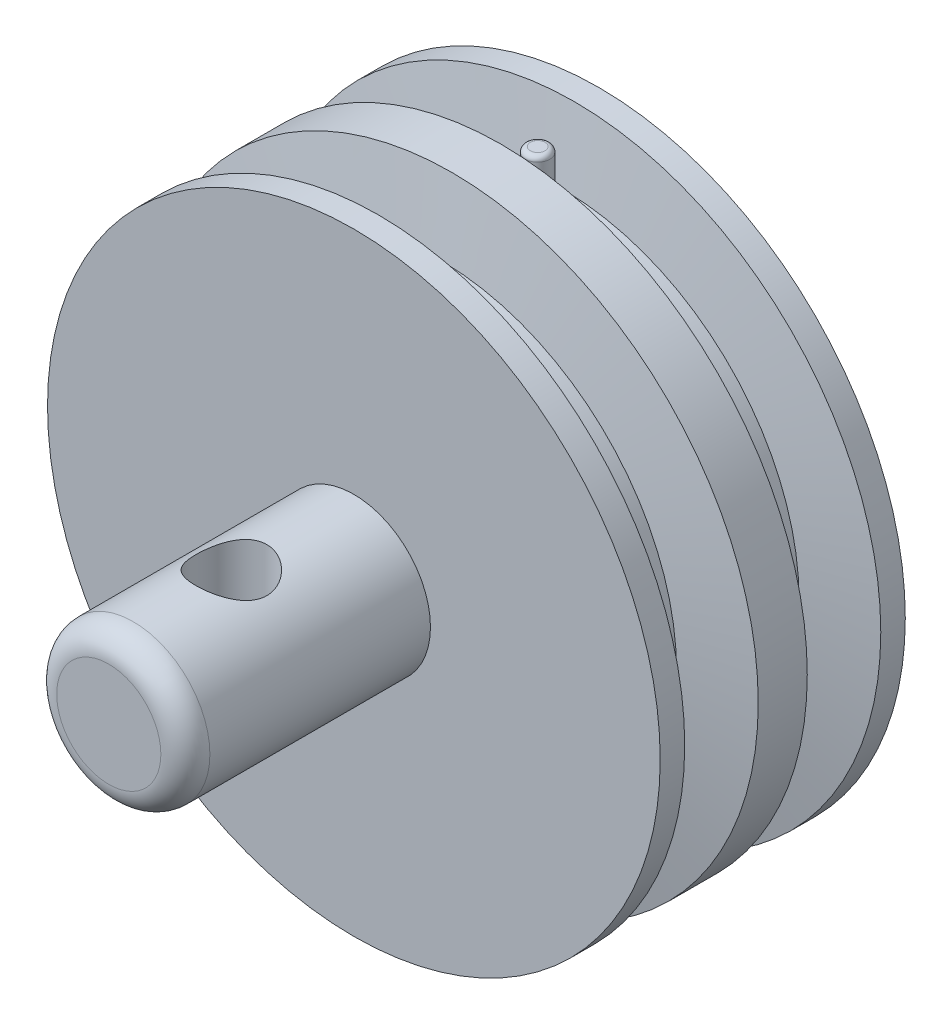
ISO-10303-21;
HEADER;
FILE_DESCRIPTION(('STEP AP214'),'2;1');
FILE_NAME('part.step','',(''),(''),'','','');
FILE_SCHEMA(('AUTOMOTIVE_DESIGN { 1 0 10303 214 1 1 1 1 }'));
ENDSEC;
DATA;
#1=APPLICATION_CONTEXT('core data for automotive mechanical design processes');
#2=APPLICATION_PROTOCOL_DEFINITION('international standard','automotive_design',2000,#1);
#3=PRODUCT_CONTEXT('',#1,'mechanical');
#4=PRODUCT('Part','Part','',(#3));
#5=PRODUCT_RELATED_PRODUCT_CATEGORY('part','',(#4));
#6=PRODUCT_DEFINITION_FORMATION('','',#4);
#7=PRODUCT_DEFINITION_CONTEXT('part definition',#1,'design');
#8=PRODUCT_DEFINITION('design','',#6,#7);
#9=PRODUCT_DEFINITION_SHAPE('','',#8);
#10=(LENGTH_UNIT() NAMED_UNIT(*) SI_UNIT(.MILLI.,.METRE.));
#11=(NAMED_UNIT(*) PLANE_ANGLE_UNIT() SI_UNIT($,.RADIAN.));
#12=(NAMED_UNIT(*) SI_UNIT($,.STERADIAN.) SOLID_ANGLE_UNIT());
#13=UNCERTAINTY_MEASURE_WITH_UNIT(LENGTH_MEASURE(1.E-05),#10,'distance_accuracy_value','');
#14=(GEOMETRIC_REPRESENTATION_CONTEXT(3) GLOBAL_UNCERTAINTY_ASSIGNED_CONTEXT((#13)) GLOBAL_UNIT_ASSIGNED_CONTEXT((#10,
#11,#12)) REPRESENTATION_CONTEXT('',''));
#15=CARTESIAN_POINT('',(0.,0.,0.));
#16=DIRECTION('',(0.,0.,1.));
#17=DIRECTION('',(1.,0.,0.));
#18=AXIS2_PLACEMENT_3D('',#15,#16,#17);
#19=CARTESIAN_POINT('',(0.,0.,-10.));
#20=DIRECTION('',(0.,0.,1.));
#21=DIRECTION('',(1.,0.,0.));
#22=AXIS2_PLACEMENT_3D('',#19,#20,#21);
#23=CYLINDRICAL_SURFACE('',#22,12.5);
#24=CARTESIAN_POINT('',(0.,0.,0.));
#25=DIRECTION('',(0.,0.,-1.));
#26=DIRECTION('',(-1.,0.,0.));
#27=AXIS2_PLACEMENT_3D('',#24,#25,#26);
#28=CIRCLE('',#27,12.5);
#29=CARTESIAN_POINT('',(-12.5,0.,0.));
#30=VERTEX_POINT('',#29);
#31=EDGE_CURVE('E167',#30,#30,#28,.T.);
#32=ORIENTED_EDGE('',*,*,#31,.T.);
#33=EDGE_LOOP('',(#32));
#34=FACE_BOUND('',#33,.T.);
#35=CARTESIAN_POINT('',(0.,0.,-1.));
#36=DIRECTION('',(0.,0.,1.));
#37=DIRECTION('',(1.,0.,0.));
#38=AXIS2_PLACEMENT_3D('',#35,#36,#37);
#39=CIRCLE('',#38,12.5);
#40=CARTESIAN_POINT('',(12.5,0.,-1.));
#41=VERTEX_POINT('',#40);
#42=EDGE_CURVE('E169',#41,#41,#39,.T.);
#43=ORIENTED_EDGE('',*,*,#42,.T.);
#44=EDGE_LOOP('',(#43));
#45=FACE_BOUND('',#44,.T.);
#46=ADVANCED_FACE('F31',(#34,#45),#23,.T.);
#47=CARTESIAN_POINT('',(0.,0.,10.));
#48=DIRECTION('',(0.,0.,-1.));
#49=DIRECTION('',(-1.,0.,0.));
#50=AXIS2_PLACEMENT_3D('',#47,#48,#49);
#51=CYLINDRICAL_SURFACE('',#50,3.125);
#52=CARTESIAN_POINT('',(0.,-3.125,6.45));
#53=CARTESIAN_POINT('',(0.0768716052901547,-3.12499654017137,6.44999586790347));
#54=CARTESIAN_POINT('',(0.153853794345693,-3.1221322690533,6.44385097081543));
#55=CARTESIAN_POINT('',(0.305583189522117,-3.11095827820961,6.4195242663458));
#56=CARTESIAN_POINT('',(0.38032499964858,-3.10263636796138,6.40131551144574));
#57=CARTESIAN_POINT('',(0.52514065145912,-3.08142637615533,6.35370391545));
#58=CARTESIAN_POINT('',(0.595230596894188,-3.0685551409428,6.32434234415211));
#59=CARTESIAN_POINT('',(0.729404512082825,-3.03945941584585,6.25545257524425));
#60=CARTESIAN_POINT('',(0.793489529469112,-3.0232355124642,6.21592615553822));
#61=CARTESIAN_POINT('',(0.917749457079842,-2.98793515867932,6.1253721219745));
#62=CARTESIAN_POINT('',(0.977523710166385,-2.96875171284097,6.07383694512185));
#63=CARTESIAN_POINT('',(1.08793997730668,-2.93009222173806,5.9618103137298));
#64=CARTESIAN_POINT('',(1.13857605001467,-2.91061599496627,5.90131307855665));
#65=CARTESIAN_POINT('',(1.23252324528846,-2.87215137480507,5.76839150867689));
#66=CARTESIAN_POINT('',(1.27515415224006,-2.85327484460032,5.69545042655879));
#67=CARTESIAN_POINT('',(1.34736606669302,-2.81989778505243,5.54244606148625));
#68=CARTESIAN_POINT('',(1.37695532062779,-2.80539449228355,5.46238731773751));
#69=CARTESIAN_POINT('',(1.42049565006142,-2.78359192058556,5.3020019441772));
#70=CARTESIAN_POINT('',(1.43522313728497,-2.77593765788476,5.22193651269336));
#71=CARTESIAN_POINT('',(1.45102635733687,-2.76771311042175,5.06013417367573));
#72=CARTESIAN_POINT('',(1.45211253648423,-2.76713740500849,4.97839859317089));
#73=CARTESIAN_POINT('',(1.44117766650617,-2.77284227245942,4.8242820924474));
#74=CARTESIAN_POINT('',(1.43044874531064,-2.77844701876985,4.75177889664138));
#75=CARTESIAN_POINT('',(1.39839474452883,-2.79471586443441,4.60975065682438));
#76=CARTESIAN_POINT('',(1.37706698618204,-2.80538124278683,4.54022637053359));
#77=CARTESIAN_POINT('',(1.32400195653508,-2.83081665351331,4.4042029321969));
#78=CARTESIAN_POINT('',(1.2920365092816,-2.84567546610072,4.33781016268567));
#79=CARTESIAN_POINT('',(1.21877046953866,-2.87781545405923,4.21103570370394));
#80=CARTESIAN_POINT('',(1.17746581275035,-2.89509768282115,4.15065664784966));
#81=CARTESIAN_POINT('',(1.08151523603346,-2.93238299134741,4.03080953105879));
#82=CARTESIAN_POINT('',(1.02591382066221,-2.9524791464405,3.97213292894236));
#83=CARTESIAN_POINT('',(0.905518094942775,-2.9915994832737,3.86463551697012));
#84=CARTESIAN_POINT('',(0.840720508367833,-3.01062327958604,3.81581823467793));
#85=CARTESIAN_POINT('',(0.700870105289448,-3.04627393989381,3.72786216093632));
#86=CARTESIAN_POINT('',(0.625538638503988,-3.06279419603615,3.6891198489341));
#87=CARTESIAN_POINT('',(0.468464075733848,-3.0907135911736,3.62514783418049));
#88=CARTESIAN_POINT('',(0.386725430084813,-3.10211624839841,3.59990884590951));
#89=CARTESIAN_POINT('',(0.225701629181554,-3.1178091382463,3.56548827152849));
#90=CARTESIAN_POINT('',(0.146688231370913,-3.12256644412945,3.55524938944003));
#91=CARTESIAN_POINT('',(-0.0120671068368493,-3.12598356044019,3.54787692371127));
#92=CARTESIAN_POINT('',(-0.0918087573396272,-3.12464569988898,3.55073833432627));
#93=CARTESIAN_POINT('',(-0.244306341537902,-3.11631184074593,3.56880129206096));
#94=CARTESIAN_POINT('',(-0.317180917692467,-3.10968669493311,3.58319426154248));
#95=CARTESIAN_POINT('',(-0.459364294809646,-3.09188387501783,3.62270883006413));
#96=CARTESIAN_POINT('',(-0.528672675335814,-3.08070566551097,3.64783169087178));
#97=CARTESIAN_POINT('',(-0.664190110343602,-3.05440500807457,3.70885909750921));
#98=CARTESIAN_POINT('',(-0.730238366156991,-3.03917186265437,3.74507137345677));
#99=CARTESIAN_POINT('',(-0.855555721280659,-3.00630223937028,3.82691356952088));
#100=CARTESIAN_POINT('',(-0.914821823418104,-2.988664706445,3.87254762852755));
#101=CARTESIAN_POINT('',(-1.03033733772604,-2.95093809581905,3.97654613302277));
#102=CARTESIAN_POINT('',(-1.08587629993254,-2.93076920504046,4.03567250679323));
#103=CARTESIAN_POINT('',(-1.18651148267303,-2.89149442525721,4.16259117280456));
#104=CARTESIAN_POINT('',(-1.23160288108748,-2.87238903019232,4.23038744436015));
#105=CARTESIAN_POINT('',(-1.31132173736169,-2.83690484600783,4.37550331939023));
#106=CARTESIAN_POINT('',(-1.34557774767094,-2.82063004339646,4.45305448470597));
#107=CARTESIAN_POINT('',(-1.40019947858562,-2.7939231345433,4.61382844819183));
#108=CARTESIAN_POINT('',(-1.42058035508842,-2.78348465548357,4.69704494839089));
#109=CARTESIAN_POINT('',(-1.44521141620336,-2.77076949653223,4.85877503799353));
#110=CARTESIAN_POINT('',(-1.45074264390206,-2.76784564689242,4.93704246107132));
#111=CARTESIAN_POINT('',(-1.44909761484816,-2.76870801694762,5.09339561264748));
#112=CARTESIAN_POINT('',(-1.4419248091463,-2.77249241434751,5.17148138472174));
#113=CARTESIAN_POINT('',(-1.41622586449008,-2.78569771981091,5.31944037746666));
#114=CARTESIAN_POINT('',(-1.39854545832788,-2.79469761783954,5.38950224210822));
#115=CARTESIAN_POINT('',(-1.35327636495865,-2.81689544042352,5.52563526385941));
#116=CARTESIAN_POINT('',(-1.32568473874645,-2.8300946100692,5.59170523044294));
#117=CARTESIAN_POINT('',(-1.2593046370902,-2.86027749752047,5.72277268974585));
#118=CARTESIAN_POINT('',(-1.21989708618644,-2.87745357358766,5.78741124497976));
#119=CARTESIAN_POINT('',(-1.13176460858238,-2.91324476703214,5.90955289071172));
#120=CARTESIAN_POINT('',(-1.08303538229627,-2.93186054609707,5.96705266821609));
#121=CARTESIAN_POINT('',(-0.971970206104432,-2.97063737208714,6.07916498422777));
#122=CARTESIAN_POINT('',(-0.908765762261198,-2.99076947267675,6.13293163771408));
#123=CARTESIAN_POINT('',(-0.773566705282083,-3.02855419940087,6.22921938739997));
#124=CARTESIAN_POINT('',(-0.701567962017635,-3.04620565209778,6.27173516986462));
#125=CARTESIAN_POINT('',(-0.551002976500324,-3.0769933709418,6.34380804229753));
#126=CARTESIAN_POINT('',(-0.472479835059436,-3.09015673066736,6.37344319934886));
#127=CARTESIAN_POINT('',(-0.310905162734269,-3.11055356763277,6.41874378341916));
#128=CARTESIAN_POINT('',(-0.227867946617002,-3.11780474283607,6.43445091605314));
#129=CARTESIAN_POINT('',(-0.120160943643351,-3.12278214322513,6.44521421298406));
#130=CARTESIAN_POINT('',(-0.096174760864419,-3.12361220445218,6.4470069674181));
#131=CARTESIAN_POINT('',(-0.0481293336872137,-3.12472167973571,6.44940051915697));
#132=CARTESIAN_POINT('',(-0.0240700879112951,-3.12500108334383,6.4500012938448));
#133=CARTESIAN_POINT('',(0.,-3.125,6.45));
#134=B_SPLINE_CURVE_WITH_KNOTS('',3,(#52,#53,#54,#55,#56,#57,#58,#59,#60,#61,#62,#63,#64,#65,
#66,#67,#68,#69,#70,#71,#72,#73,#74,#75,#76,#77,#78,#79,#80,#81,#82,#83,#84,#85,#86,#87,#88,#89,
#90,#91,#92,#93,#94,#95,#96,#97,#98,#99,#100,#101,#102,#103,#104,#105,#106,#107,#108,#109,#110,
#111,#112,#113,#114,#115,#116,#117,#118,#119,#120,#121,#122,#123,#124,#125,#126,#127,#128,#129,
#130,#131,#132,#133),.UNSPECIFIED.,.T.,.F.,(4,2,2,2,2,2,2,2,2,2,2,2,2,2,2,2,2,2,2,2,2,2,2,2,2,2,
2,2,2,2,2,2,2,2,2,2,2,2,2,2,4),(0.,0.230516371630332,0.461549400753721,0.691735716509659,
0.921881798400275,1.16451177160954,1.40729893098373,1.66569497064884,1.92392738738805,
2.16783553157161,2.41155688298075,2.63105230784912,2.85060323644229,3.07520475712157,
3.29990421014558,3.54869036961603,3.79756538514588,4.05511168491926,4.31248065539265,
4.55065256428205,4.78873347304892,5.01144440127294,5.2341815261106,5.46376657658349,
5.69345269676118,5.94311138890871,6.19288508360442,6.45047200657537,6.70777711231321,
6.94204099932318,7.17624125830721,7.39374728131239,7.61131785537682,7.84325593711941,
8.07530125846212,8.33026199196084,8.58534292819831,8.83885554378647,9.09160646090031,
9.16378453019225,9.23596396900053),.UNSPECIFIED.);
#135=CARTESIAN_POINT('',(0.,-3.125,6.45));
#136=VERTEX_POINT('',#135);
#137=EDGE_CURVE('E98',#136,#136,#134,.T.);
#138=ORIENTED_EDGE('',*,*,#137,.T.);
#139=EDGE_LOOP('',(#138));
#140=FACE_BOUND('',#139,.T.);
#141=CARTESIAN_POINT('',(0.,3.125,6.45));
#142=CARTESIAN_POINT('',(-0.0768716052901535,3.12499654017137,6.44999586790347));
#143=CARTESIAN_POINT('',(-0.153853794345692,3.1221322690533,6.44385097081543));
#144=CARTESIAN_POINT('',(-0.305583189522116,3.11095827820961,6.4195242663458));
#145=CARTESIAN_POINT('',(-0.380324999648579,3.10263636796138,6.40131551144574));
#146=CARTESIAN_POINT('',(-0.525140651459119,3.08142637615533,6.35370391545));
#147=CARTESIAN_POINT('',(-0.595230596894187,3.0685551409428,6.32434234415211));
#148=CARTESIAN_POINT('',(-0.729404512082824,3.03945941584585,6.25545257524425));
#149=CARTESIAN_POINT('',(-0.793489529469111,3.0232355124642,6.21592615553822));
#150=CARTESIAN_POINT('',(-0.917749457079841,2.98793515867932,6.1253721219745));
#151=CARTESIAN_POINT('',(-0.977523710166384,2.96875171284097,6.07383694512185));
#152=CARTESIAN_POINT('',(-1.08793997730667,2.93009222173806,5.9618103137298));
#153=CARTESIAN_POINT('',(-1.13857605001467,2.91061599496627,5.90131307855665));
#154=CARTESIAN_POINT('',(-1.23252324528846,2.87215137480507,5.76839150867689));
#155=CARTESIAN_POINT('',(-1.27515415224006,2.85327484460032,5.69545042655879));
#156=CARTESIAN_POINT('',(-1.34736606669301,2.81989778505243,5.54244606148625));
#157=CARTESIAN_POINT('',(-1.37695532062778,2.80539449228355,5.46238731773751));
#158=CARTESIAN_POINT('',(-1.42049565006142,2.78359192058556,5.3020019441772));
#159=CARTESIAN_POINT('',(-1.43522313728497,2.77593765788476,5.22193651269336));
#160=CARTESIAN_POINT('',(-1.45102635733687,2.76771311042175,5.06013417367573));
#161=CARTESIAN_POINT('',(-1.45211253648423,2.76713740500849,4.97839859317089));
#162=CARTESIAN_POINT('',(-1.44117766650616,2.77284227245942,4.8242820924474));
#163=CARTESIAN_POINT('',(-1.43044874531064,2.77844701876985,4.75177889664138));
#164=CARTESIAN_POINT('',(-1.39839474452883,2.79471586443441,4.60975065682438));
#165=CARTESIAN_POINT('',(-1.37706698618204,2.80538124278683,4.54022637053359));
#166=CARTESIAN_POINT('',(-1.32400195653508,2.83081665351331,4.4042029321969));
#167=CARTESIAN_POINT('',(-1.2920365092816,2.84567546610072,4.33781016268567));
#168=CARTESIAN_POINT('',(-1.21877046953866,2.87781545405923,4.21103570370394));
#169=CARTESIAN_POINT('',(-1.17746581275035,2.89509768282115,4.15065664784966));
#170=CARTESIAN_POINT('',(-1.08151523603346,2.93238299134741,4.03080953105879));
#171=CARTESIAN_POINT('',(-1.02591382066221,2.9524791464405,3.97213292894236));
#172=CARTESIAN_POINT('',(-0.905518094942774,2.9915994832737,3.86463551697012));
#173=CARTESIAN_POINT('',(-0.840720508367833,3.01062327958604,3.81581823467793));
#174=CARTESIAN_POINT('',(-0.700870105289447,3.04627393989381,3.72786216093632));
#175=CARTESIAN_POINT('',(-0.625538638503987,3.06279419603615,3.6891198489341));
#176=CARTESIAN_POINT('',(-0.468464075733847,3.0907135911736,3.62514783418049));
#177=CARTESIAN_POINT('',(-0.386725430084812,3.10211624839841,3.59990884590951));
#178=CARTESIAN_POINT('',(-0.225701629181552,3.1178091382463,3.56548827152849));
#179=CARTESIAN_POINT('',(-0.146688231370912,3.12256644412945,3.55524938944003));
#180=CARTESIAN_POINT('',(0.0120671068368506,3.12598356044019,3.54787692371127));
#181=CARTESIAN_POINT('',(0.0918087573396285,3.12464569988898,3.55073833432627));
#182=CARTESIAN_POINT('',(0.244306341537903,3.11631184074593,3.56880129206096));
#183=CARTESIAN_POINT('',(0.317180917692469,3.10968669493311,3.58319426154248));
#184=CARTESIAN_POINT('',(0.459364294809647,3.09188387501783,3.62270883006413));
#185=CARTESIAN_POINT('',(0.528672675335815,3.08070566551097,3.64783169087179));
#186=CARTESIAN_POINT('',(0.664190110343604,3.05440500807457,3.70885909750921));
#187=CARTESIAN_POINT('',(0.730238366156993,3.03917186265437,3.74507137345677));
#188=CARTESIAN_POINT('',(0.855555721280661,3.00630223937028,3.82691356952088));
#189=CARTESIAN_POINT('',(0.914821823418105,2.988664706445,3.87254762852755));
#190=CARTESIAN_POINT('',(1.03033733772604,2.95093809581905,3.97654613302277));
#191=CARTESIAN_POINT('',(1.08587629993254,2.93076920504045,4.03567250679323));
#192=CARTESIAN_POINT('',(1.18651148267303,2.89149442525721,4.16259117280456));
#193=CARTESIAN_POINT('',(1.23160288108748,2.87238903019231,4.23038744436015));
#194=CARTESIAN_POINT('',(1.31132173736169,2.83690484600783,4.37550331939023));
#195=CARTESIAN_POINT('',(1.34557774767094,2.82063004339646,4.45305448470597));
#196=CARTESIAN_POINT('',(1.40019947858562,2.7939231345433,4.61382844819183));
#197=CARTESIAN_POINT('',(1.42058035508842,2.78348465548357,4.69704494839089));
#198=CARTESIAN_POINT('',(1.44521141620336,2.77076949653223,4.85877503799353));
#199=CARTESIAN_POINT('',(1.45074264390206,2.76784564689242,4.93704246107132));
#200=CARTESIAN_POINT('',(1.44909761484816,2.76870801694762,5.09339561264748));
#201=CARTESIAN_POINT('',(1.4419248091463,2.77249241434751,5.17148138472174));
#202=CARTESIAN_POINT('',(1.41622586449008,2.78569771981091,5.31944037746666));
#203=CARTESIAN_POINT('',(1.39854545832788,2.79469761783954,5.38950224210822));
#204=CARTESIAN_POINT('',(1.35327636495865,2.81689544042352,5.52563526385941));
#205=CARTESIAN_POINT('',(1.32568473874645,2.83009461006919,5.59170523044294));
#206=CARTESIAN_POINT('',(1.2593046370902,2.86027749752047,5.72277268974585));
#207=CARTESIAN_POINT('',(1.21989708618644,2.87745357358766,5.78741124497976));
#208=CARTESIAN_POINT('',(1.13176460858238,2.91324476703214,5.90955289071172));
#209=CARTESIAN_POINT('',(1.08303538229627,2.93186054609707,5.96705266821609));
#210=CARTESIAN_POINT('',(0.971970206104434,2.97063737208714,6.07916498422777));
#211=CARTESIAN_POINT('',(0.9087657622612,2.99076947267675,6.13293163771408));
#212=CARTESIAN_POINT('',(0.773566705282085,3.02855419940087,6.22921938739997));
#213=CARTESIAN_POINT('',(0.701567962017637,3.04620565209778,6.27173516986462));
#214=CARTESIAN_POINT('',(0.551002976500326,3.0769933709418,6.34380804229753));
#215=CARTESIAN_POINT('',(0.472479835059438,3.09015673066736,6.37344319934886));
#216=CARTESIAN_POINT('',(0.310905162734271,3.11055356763277,6.41874378341916));
#217=CARTESIAN_POINT('',(0.227867946617004,3.11780474283607,6.43445091605314));
#218=CARTESIAN_POINT('',(0.120160943643353,3.12278214322513,6.44521421298406));
#219=CARTESIAN_POINT('',(0.0961747608644205,3.12361220445218,6.4470069674181));
#220=CARTESIAN_POINT('',(0.048129333687215,3.12472167973571,6.44940051915697));
#221=CARTESIAN_POINT('',(0.0240700879112964,3.12500108334383,6.4500012938448));
#222=CARTESIAN_POINT('',(0.,3.125,6.45));
#223=B_SPLINE_CURVE_WITH_KNOTS('',3,(#141,#142,#143,#144,#145,#146,#147,#148,#149,#150,#151,
#152,#153,#154,#155,#156,#157,#158,#159,#160,#161,#162,#163,#164,#165,#166,#167,#168,#169,#170,
#171,#172,#173,#174,#175,#176,#177,#178,#179,#180,#181,#182,#183,#184,#185,#186,#187,#188,#189,
#190,#191,#192,#193,#194,#195,#196,#197,#198,#199,#200,#201,#202,#203,#204,#205,#206,#207,#208,
#209,#210,#211,#212,#213,#214,#215,#216,#217,#218,#219,#220,#221,#222),.UNSPECIFIED.,.T.,.F.,(4,
2,2,2,2,2,2,2,2,2,2,2,2,2,2,2,2,2,2,2,2,2,2,2,2,2,2,2,2,2,2,2,2,2,2,2,2,2,2,2,4),(0.,
0.230516371630333,0.461549400753721,0.691735716509659,0.921881798400275,1.16451177160954,
1.40729893098373,1.66569497064884,1.92392738738805,2.16783553157161,2.41155688298075,
2.63105230784912,2.85060323644229,3.07520475712157,3.29990421014557,3.54869036961602,
3.79756538514588,4.05511168491926,4.31248065539265,4.55065256428205,4.78873347304892,
5.01144440127294,5.2341815261106,5.46376657658349,5.69345269676118,5.9431113889087,
6.19288508360442,6.45047200657537,6.70777711231321,6.94204099932318,7.17624125830721,
7.39374728131239,7.61131785537682,7.84325593711941,8.07530125846212,8.33026199196084,
8.58534292819831,8.83885554378647,9.09160646090031,9.16378453019225,9.23596396900053),.UNSPECIFIED.);
#224=CARTESIAN_POINT('',(0.,3.125,6.45));
#225=VERTEX_POINT('',#224);
#226=EDGE_CURVE('E92',#225,#225,#223,.T.);
#227=ORIENTED_EDGE('',*,*,#226,.T.);
#228=EDGE_LOOP('',(#227));
#229=FACE_BOUND('',#228,.T.);
#230=CARTESIAN_POINT('',(0.,0.,9.));
#231=DIRECTION('',(0.,0.,1.));
#232=DIRECTION('',(1.,0.,0.));
#233=AXIS2_PLACEMENT_3D('',#230,#231,#232);
#234=CIRCLE('',#233,3.125);
#235=CARTESIAN_POINT('',(3.125,0.,9.));
#236=VERTEX_POINT('',#235);
#237=EDGE_CURVE('E174',#236,#236,#234,.F.);
#238=ORIENTED_EDGE('',*,*,#237,.T.);
#239=EDGE_LOOP('',(#238));
#240=FACE_BOUND('',#239,.T.);
#241=CARTESIAN_POINT('',(0.,0.,0.));
#242=DIRECTION('',(0.,0.,1.));
#243=DIRECTION('',(1.,0.,0.));
#244=AXIS2_PLACEMENT_3D('',#241,#242,#243);
#245=CIRCLE('',#244,3.125);
#246=CARTESIAN_POINT('',(3.125,0.,0.));
#247=VERTEX_POINT('',#246);
#248=EDGE_CURVE('E166',#247,#247,#245,.T.);
#249=ORIENTED_EDGE('',*,*,#248,.T.);
#250=EDGE_LOOP('',(#249));
#251=FACE_BOUND('',#250,.T.);
#252=ADVANCED_FACE('F104',(#140,#229,#240,#251),#51,.T.);
#253=CARTESIAN_POINT('',(0.,0.,10.));
#254=DIRECTION('',(0.,0.,1.));
#255=DIRECTION('',(1.,0.,0.));
#256=AXIS2_PLACEMENT_3D('',#253,#254,#255);
#257=PLANE('',#256);
#258=CARTESIAN_POINT('',(0.,0.,10.));
#259=DIRECTION('',(0.,0.,1.));
#260=DIRECTION('',(1.,0.,0.));
#261=AXIS2_PLACEMENT_3D('',#258,#259,#260);
#262=CIRCLE('',#261,2.125);
#263=CARTESIAN_POINT('',(2.125,0.,10.));
#264=VERTEX_POINT('',#263);
#265=EDGE_CURVE('E172',#264,#264,#262,.T.);
#266=ORIENTED_EDGE('',*,*,#265,.T.);
#267=EDGE_LOOP('',(#266));
#268=FACE_BOUND('',#267,.T.);
#269=ADVANCED_FACE('F109',(#268),#257,.T.);
#270=CARTESIAN_POINT('',(0.,0.,9.));
#271=DIRECTION('',(0.,0.,1.));
#272=DIRECTION('',(1.,0.,0.));
#273=AXIS2_PLACEMENT_3D('',#270,#271,#272);
#274=TOROIDAL_SURFACE('',#273,2.125,1.);
#275=ORIENTED_EDGE('',*,*,#237,.F.);
#276=EDGE_LOOP('',(#275));
#277=FACE_BOUND('',#276,.T.);
#278=ORIENTED_EDGE('',*,*,#265,.F.);
#279=EDGE_LOOP('',(#278));
#280=FACE_BOUND('',#279,.T.);
#281=ADVANCED_FACE('F112',(#277,#280),#274,.T.);
#282=CARTESIAN_POINT('',(0.,0.,0.));
#283=DIRECTION('',(0.,0.,-1.));
#284=DIRECTION('',(-1.,0.,0.));
#285=AXIS2_PLACEMENT_3D('',#282,#283,#284);
#286=PLANE('',#285);
#287=ORIENTED_EDGE('',*,*,#248,.F.);
#288=EDGE_LOOP('',(#287));
#289=FACE_BOUND('',#288,.T.);
#290=ORIENTED_EDGE('',*,*,#31,.F.);
#291=EDGE_LOOP('',(#290));
#292=FACE_BOUND('',#291,.T.);
#293=ADVANCED_FACE('F115',(#289,#292),#286,.F.);
#294=CARTESIAN_POINT('',(0.,0.,-1.));
#295=DIRECTION('',(0.,0.,1.));
#296=DIRECTION('',(1.,0.,0.));
#297=AXIS2_PLACEMENT_3D('',#294,#295,#296);
#298=CONICAL_SURFACE('',#297,12.5,1.39626340159547);
#299=CARTESIAN_POINT('',(0.,0.,-1.5));
#300=DIRECTION('',(0.,0.,1.));
#301=DIRECTION('',(1.,0.,0.));
#302=AXIS2_PLACEMENT_3D('',#299,#300,#301);
#303=CIRCLE('',#302,9.66435909019109);
#304=CARTESIAN_POINT('',(9.66435909019109,0.,-1.5));
#305=VERTEX_POINT('',#304);
#306=EDGE_CURVE('E193',#305,#305,#303,.T.);
#307=ORIENTED_EDGE('',*,*,#306,.T.);
#308=EDGE_LOOP('',(#307));
#309=FACE_BOUND('',#308,.T.);
#310=ORIENTED_EDGE('',*,*,#42,.F.);
#311=EDGE_LOOP('',(#310));
#312=FACE_BOUND('',#311,.T.);
#313=ADVANCED_FACE('F209',(#309,#312),#298,.T.);
#314=CARTESIAN_POINT('',(0.,0.,0.));
#315=DIRECTION('',(0.,0.,1.));
#316=DIRECTION('',(1.,0.,0.));
#317=AXIS2_PLACEMENT_3D('',#314,#315,#316);
#318=CYLINDRICAL_SURFACE('',#317,9.66435909019109);
#319=CARTESIAN_POINT('',(0.,-9.66435909019109,-3.));
#320=CARTESIAN_POINT('',(0.0280650760185085,-9.66435891728428,-2.99999876185837));
#321=CARTESIAN_POINT('',(0.0561500232965514,-9.66423553062454,-2.997629117818));
#322=CARTESIAN_POINT('',(0.111545062637845,-9.66375517870961,-2.98820979459429));
#323=CARTESIAN_POINT('',(0.138854203677524,-9.66339793867225,-2.98115460966927));
#324=CARTESIAN_POINT('',(0.191887169539539,-9.66249031105015,-2.96256682412411));
#325=CARTESIAN_POINT('',(0.217611798056304,-9.66194002234765,-2.95103651540437));
#326=CARTESIAN_POINT('',(0.266753507647339,-9.66070826267977,-2.92382933180292));
#327=CARTESIAN_POINT('',(0.290171129624943,-9.6600268225755,-2.90815343209206));
#328=CARTESIAN_POINT('',(0.334066117195868,-9.65860859399509,-2.87308139834803));
#329=CARTESIAN_POINT('',(0.354540702327894,-9.65787175416738,-2.85368178618129));
#330=CARTESIAN_POINT('',(0.391944710164128,-9.65642621460703,-2.81171999390288));
#331=CARTESIAN_POINT('',(0.408873987638484,-9.65571751602814,-2.78915768429776));
#332=CARTESIAN_POINT('',(0.43871464055259,-9.65440780762013,-2.74149617423983));
#333=CARTESIAN_POINT('',(0.451623821068999,-9.65380685669561,-2.71639559779699));
#334=CARTESIAN_POINT('',(0.473043760791749,-9.65278104382706,-2.66437974680399));
#335=CARTESIAN_POINT('',(0.481554555120606,-9.65235618047693,-2.63746448674658));
#336=CARTESIAN_POINT('',(0.493928722725643,-9.65173092227323,-2.58260908115773));
#337=CARTESIAN_POINT('',(0.497796290018725,-9.65153032486166,-2.5546698840496));
#338=CARTESIAN_POINT('',(0.500787158539221,-9.65137561166038,-2.49853816295734));
#339=CARTESIAN_POINT('',(0.499910499251231,-9.65142149381929,-2.4703456410835));
#340=CARTESIAN_POINT('',(0.493441291406903,-9.65175437744844,-2.4145360688589));
#341=CARTESIAN_POINT('',(0.487853275171575,-9.65204114718408,-2.38691849156703));
#342=CARTESIAN_POINT('',(0.47212700115365,-9.65282311980368,-2.33301389326366));
#343=CARTESIAN_POINT('',(0.461988723130834,-9.65331832361479,-2.30672687817126));
#344=CARTESIAN_POINT('',(0.437444541842198,-9.65446161862094,-2.25621499977897));
#345=CARTESIAN_POINT('',(0.423036573545687,-9.65510978376459,-2.23199114163775));
#346=CARTESIAN_POINT('',(0.390363504372272,-9.65648587300675,-2.18630419683438));
#347=CARTESIAN_POINT('',(0.372098374244781,-9.65721379771009,-2.16484113111053));
#348=CARTESIAN_POINT('',(0.332203891019647,-9.65866839322497,-2.12525865039991));
#349=CARTESIAN_POINT('',(0.310570613383147,-9.65939506156106,-2.10714319055914));
#350=CARTESIAN_POINT('',(0.264567712677067,-9.66076442025787,-2.07480063417131));
#351=CARTESIAN_POINT('',(0.240198088903051,-9.66140711059697,-2.06057353862526));
#352=CARTESIAN_POINT('',(0.18941193570775,-9.66253611337631,-2.03641193947923));
#353=CARTESIAN_POINT('',(0.162995339801536,-9.66302242073464,-2.02647757537463));
#354=CARTESIAN_POINT('',(0.10886614456961,-9.66378377765343,-2.01118603161316));
#355=CARTESIAN_POINT('',(0.081153555630165,-9.66405882890661,-2.00582881528103));
#356=CARTESIAN_POINT('',(0.0252533664647164,-9.66436645783231,-1.99984851677907));
#357=CARTESIAN_POINT('',(-0.0029336470566775,-9.66439931568713,-1.99921996421999));
#358=CARTESIAN_POINT('',(-0.0590127410688857,-9.66421959880437,-2.0027005574827));
#359=CARTESIAN_POINT('',(-0.0869048226049272,-9.66400702493688,-2.00680968650865));
#360=CARTESIAN_POINT('',(-0.141586959628782,-9.66336056617158,-2.01964447190429));
#361=CARTESIAN_POINT('',(-0.16837760327541,-9.66292680109134,-2.02836762898593));
#362=CARTESIAN_POINT('',(-0.220114498812783,-9.66188679137154,-2.05018031766824));
#363=CARTESIAN_POINT('',(-0.245060739329895,-9.66128054566848,-2.06326987619188));
#364=CARTESIAN_POINT('',(-0.29242580598746,-9.65996306628065,-2.09345779871617));
#365=CARTESIAN_POINT('',(-0.314842293356485,-9.65925173682541,-2.11055982802527));
#366=CARTESIAN_POINT('',(-0.356488012655926,-9.65780451192519,-2.14828187563756));
#367=CARTESIAN_POINT('',(-0.375717222769419,-9.65706861631209,-2.1689019180196));
#368=CARTESIAN_POINT('',(-0.410460972094506,-9.65565440103037,-2.2130982060814));
#369=CARTESIAN_POINT('',(-0.425971970725582,-9.65497613663326,-2.23667723710347));
#370=CARTESIAN_POINT('',(-0.452814795687847,-9.65375453932591,-2.28610811603758));
#371=CARTESIAN_POINT('',(-0.464146641166448,-9.65321120579747,-2.31195995353576));
#372=CARTESIAN_POINT('',(-0.482303322181929,-9.65232113503537,-2.36518951280983));
#373=CARTESIAN_POINT('',(-0.489130411224373,-9.65197429951581,-2.39256646420259));
#374=CARTESIAN_POINT('',(-0.498091152475214,-9.65151606057403,-2.44807989082278));
#375=CARTESIAN_POINT('',(-0.500224833827037,-9.65140465568992,-2.47621636133294));
#376=CARTESIAN_POINT('',(-0.499737916699052,-9.65142987694451,-2.53241489733293));
#377=CARTESIAN_POINT('',(-0.497122887586933,-9.65156621252914,-2.56047701137813));
#378=CARTESIAN_POINT('',(-0.487224297598006,-9.65207093482535,-2.61576321960929));
#379=CARTESIAN_POINT('',(-0.479940727872444,-9.65243932197675,-2.64298731220676));
#380=CARTESIAN_POINT('',(-0.460912965797975,-9.65336656184317,-2.69582580310447));
#381=CARTESIAN_POINT('',(-0.449168747406938,-9.65392541567017,-2.72144019200592));
#382=CARTESIAN_POINT('',(-0.421553989841467,-9.65517058628802,-2.77033405990191));
#383=CARTESIAN_POINT('',(-0.405683574787143,-9.65585689924461,-2.79361360910156));
#384=CARTESIAN_POINT('',(-0.370246863312473,-9.65728055820499,-2.83720487208023));
#385=CARTESIAN_POINT('',(-0.350676658239329,-9.65801795765248,-2.85751340650492));
#386=CARTESIAN_POINT('',(-0.308398962282497,-9.65946028932932,-2.89456326938671));
#387=CARTESIAN_POINT('',(-0.285690701314097,-9.66016521353239,-2.91130371965778));
#388=CARTESIAN_POINT('',(-0.237762672982017,-9.66146367901665,-2.94075060161327));
#389=CARTESIAN_POINT('',(-0.212540434379792,-9.66205710901303,-2.9534530114982));
#390=CARTESIAN_POINT('',(-0.160337011952519,-9.66306407853664,-2.97442759134842));
#391=CARTESIAN_POINT('',(-0.133357945931113,-9.66347783020801,-2.98270498855891));
#392=CARTESIAN_POINT('',(-0.0885096473672196,-9.66396951221484,-2.99242588469273));
#393=CARTESIAN_POINT('',(-0.0709308327084652,-9.66411496101148,-2.99526254591668));
#394=CARTESIAN_POINT('',(-0.0355706731906576,-9.66430980475488,-2.99904999510914));
#395=CARTESIAN_POINT('',(-0.0177893285174945,-9.6643591997898,-3.00000078480843));
#396=CARTESIAN_POINT('',(0.,-9.66435909019109,-3.));
#397=B_SPLINE_CURVE_WITH_KNOTS('',3,(#319,#320,#321,#322,#323,#324,#325,#326,#327,#328,#329,
#330,#331,#332,#333,#334,#335,#336,#337,#338,#339,#340,#341,#342,#343,#344,#345,#346,#347,#348,
#349,#350,#351,#352,#353,#354,#355,#356,#357,#358,#359,#360,#361,#362,#363,#364,#365,#366,#367,
#368,#369,#370,#371,#372,#373,#374,#375,#376,#377,#378,#379,#380,#381,#382,#383,#384,#385,#386,
#387,#388,#389,#390,#391,#392,#393,#394,#395,#396),.UNSPECIFIED.,.T.,.F.,(4,2,2,2,2,2,2,2,2,2,2,
2,2,2,2,2,2,2,2,2,2,2,2,2,2,2,2,2,2,2,2,2,2,2,2,2,2,2,4),(0.,0.0841302898807771,
0.168359612326419,0.252545854170489,0.336712310401999,0.420957768271094,0.505206676493217,
0.589501503257258,0.673795656889841,0.758013614004581,0.842230870202788,0.926367201797356,
1.01050390764615,1.09468137271216,1.17885947615655,1.26313640762117,1.34741336078179,
1.43169305237622,1.51597206865729,1.60015357112741,1.6843347751616,1.76847042725255,
1.85260659812832,1.93681992695481,2.02103383219801,2.10532761243475,2.18962100646218,
2.27387220066371,2.35812287171114,2.44227479596032,2.52642687971155,2.61057945476645,
2.69472949872081,2.77896894508979,2.86322910080717,2.94757291675211,3.03181687636437,
3.08514374914832,3.13847057299067),.UNSPECIFIED.);
#398=CARTESIAN_POINT('',(0.,-9.66435909019109,-3.));
#399=VERTEX_POINT('',#398);
#400=EDGE_CURVE('E51',#399,#399,#397,.T.);
#401=ORIENTED_EDGE('',*,*,#400,.F.);
#402=EDGE_LOOP('',(#401));
#403=FACE_BOUND('',#402,.T.);
#404=CARTESIAN_POINT('',(0.,0.,-3.5));
#405=DIRECTION('',(0.,0.,1.));
#406=DIRECTION('',(1.,0.,0.));
#407=AXIS2_PLACEMENT_3D('',#404,#405,#406);
#408=CIRCLE('',#407,9.66435909019109);
#409=CARTESIAN_POINT('',(9.66435909019109,0.,-3.5));
#410=VERTEX_POINT('',#409);
#411=EDGE_CURVE('E196',#410,#410,#408,.T.);
#412=ORIENTED_EDGE('',*,*,#411,.T.);
#413=EDGE_LOOP('',(#412));
#414=FACE_BOUND('',#413,.T.);
#415=ORIENTED_EDGE('',*,*,#306,.F.);
#416=EDGE_LOOP('',(#415));
#417=FACE_BOUND('',#416,.T.);
#418=ADVANCED_FACE('F66',(#403,#414,#417),#318,.T.);
#419=CARTESIAN_POINT('',(0.,0.,-3.5));
#420=DIRECTION('',(0.,0.,-1.));
#421=DIRECTION('',(-1.,0.,0.));
#422=AXIS2_PLACEMENT_3D('',#419,#420,#421);
#423=CONICAL_SURFACE('',#422,9.66435909019109,1.39626340159547);
#424=CARTESIAN_POINT('',(0.,0.,-4.));
#425=DIRECTION('',(0.,0.,1.));
#426=DIRECTION('',(1.,0.,0.));
#427=AXIS2_PLACEMENT_3D('',#424,#425,#426);
#428=CIRCLE('',#427,12.5);
#429=CARTESIAN_POINT('',(12.5,0.,-4.));
#430=VERTEX_POINT('',#429);
#431=EDGE_CURVE('E159',#430,#430,#428,.T.);
#432=ORIENTED_EDGE('',*,*,#431,.T.);
#433=EDGE_LOOP('',(#432));
#434=FACE_BOUND('',#433,.T.);
#435=ORIENTED_EDGE('',*,*,#411,.F.);
#436=EDGE_LOOP('',(#435));
#437=FACE_BOUND('',#436,.T.);
#438=ADVANCED_FACE('F89',(#434,#437),#423,.T.);
#439=CARTESIAN_POINT('',(0.,0.,-6.));
#440=DIRECTION('',(0.,0.,1.));
#441=DIRECTION('',(1.,0.,0.));
#442=AXIS2_PLACEMENT_3D('',#439,#440,#441);
#443=CIRCLE('',#442,12.5);
#444=CARTESIAN_POINT('',(12.5,0.,-6.));
#445=VERTEX_POINT('',#444);
#446=EDGE_CURVE('E155',#445,#445,#443,.T.);
#447=ORIENTED_EDGE('',*,*,#446,.T.);
#448=EDGE_LOOP('',(#447));
#449=FACE_BOUND('',#448,.T.);
#450=ORIENTED_EDGE('',*,*,#431,.F.);
#451=EDGE_LOOP('',(#450));
#452=FACE_BOUND('',#451,.T.);
#453=ADVANCED_FACE('F129',(#449,#452),#23,.T.);
#454=CARTESIAN_POINT('',(0.,0.,-6.));
#455=DIRECTION('',(0.,0.,1.));
#456=DIRECTION('',(1.,0.,0.));
#457=AXIS2_PLACEMENT_3D('',#454,#455,#456);
#458=CONICAL_SURFACE('',#457,12.5,1.39626340159547);
#459=CARTESIAN_POINT('',(0.,0.,-6.5));
#460=DIRECTION('',(0.,0.,1.));
#461=DIRECTION('',(1.,0.,0.));
#462=AXIS2_PLACEMENT_3D('',#459,#460,#461);
#463=CIRCLE('',#462,9.66435909019109);
#464=CARTESIAN_POINT('',(9.66435909019109,0.,-6.5));
#465=VERTEX_POINT('',#464);
#466=EDGE_CURVE('E103',#465,#465,#463,.T.);
#467=ORIENTED_EDGE('',*,*,#466,.T.);
#468=EDGE_LOOP('',(#467));
#469=FACE_BOUND('',#468,.T.);
#470=ORIENTED_EDGE('',*,*,#446,.F.);
#471=EDGE_LOOP('',(#470));
#472=FACE_BOUND('',#471,.T.);
#473=ADVANCED_FACE('F136',(#469,#472),#458,.T.);
#474=CARTESIAN_POINT('',(0.,0.,-8.5));
#475=DIRECTION('',(0.,0.,-1.));
#476=DIRECTION('',(-1.,0.,0.));
#477=AXIS2_PLACEMENT_3D('',#474,#475,#476);
#478=CONICAL_SURFACE('',#477,9.66435909019109,1.39626340159547);
#479=CARTESIAN_POINT('',(0.,0.,-9.));
#480=DIRECTION('',(0.,0.,1.));
#481=DIRECTION('',(1.,0.,0.));
#482=AXIS2_PLACEMENT_3D('',#479,#480,#481);
#483=CIRCLE('',#482,12.5);
#484=CARTESIAN_POINT('',(12.5,0.,-9.));
#485=VERTEX_POINT('',#484);
#486=EDGE_CURVE('E153',#485,#485,#483,.T.);
#487=ORIENTED_EDGE('',*,*,#486,.T.);
#488=EDGE_LOOP('',(#487));
#489=FACE_BOUND('',#488,.T.);
#490=CARTESIAN_POINT('',(0.,0.,-8.5));
#491=DIRECTION('',(0.,0.,1.));
#492=DIRECTION('',(1.,0.,0.));
#493=AXIS2_PLACEMENT_3D('',#490,#491,#492);
#494=CIRCLE('',#493,9.66435909019109);
#495=CARTESIAN_POINT('',(9.66435909019109,0.,-8.5));
#496=VERTEX_POINT('',#495);
#497=EDGE_CURVE('E156',#496,#496,#494,.T.);
#498=ORIENTED_EDGE('',*,*,#497,.F.);
#499=EDGE_LOOP('',(#498));
#500=FACE_BOUND('',#499,.T.);
#501=ADVANCED_FACE('F184',(#489,#500),#478,.T.);
#502=CARTESIAN_POINT('',(0.,0.,0.));
#503=DIRECTION('',(0.,0.,1.));
#504=DIRECTION('',(1.,0.,0.));
#505=AXIS2_PLACEMENT_3D('',#502,#503,#504);
#506=CYLINDRICAL_SURFACE('',#505,9.66435909019109);
#507=CARTESIAN_POINT('',(0.,9.66435909019109,-7.));
#508=CARTESIAN_POINT('',(0.0280650760185085,9.66435891728428,-7.00000123814163));
#509=CARTESIAN_POINT('',(0.0561500232965513,9.66423553062454,-7.002370882182));
#510=CARTESIAN_POINT('',(0.111545062637845,9.66375517870961,-7.01179020540571));
#511=CARTESIAN_POINT('',(0.138854203677524,9.66339793867225,-7.01884539033073));
#512=CARTESIAN_POINT('',(0.191887169539539,9.66249031105015,-7.03743317587589));
#513=CARTESIAN_POINT('',(0.217611798056304,9.66194002234765,-7.04896348459563));
#514=CARTESIAN_POINT('',(0.266753507647339,9.66070826267977,-7.07617066819708));
#515=CARTESIAN_POINT('',(0.290171129624943,9.6600268225755,-7.09184656790794));
#516=CARTESIAN_POINT('',(0.334066117195868,9.65860859399509,-7.12691860165197));
#517=CARTESIAN_POINT('',(0.354540702327895,9.65787175416738,-7.14631821381871));
#518=CARTESIAN_POINT('',(0.391944710164128,9.65642621460703,-7.18828000609712));
#519=CARTESIAN_POINT('',(0.408873987638484,9.65571751602814,-7.21084231570225));
#520=CARTESIAN_POINT('',(0.43871464055259,9.65440780762013,-7.25850382576017));
#521=CARTESIAN_POINT('',(0.451623821068999,9.65380685669561,-7.28360440220301));
#522=CARTESIAN_POINT('',(0.47304376079175,9.65278104382706,-7.33562025319601));
#523=CARTESIAN_POINT('',(0.481554555120607,9.65235618047693,-7.36253551325342));
#524=CARTESIAN_POINT('',(0.493928722725643,9.65173092227323,-7.41739091884227));
#525=CARTESIAN_POINT('',(0.497796290018726,9.65153032486166,-7.4453301159504));
#526=CARTESIAN_POINT('',(0.500787158539222,9.65137561166038,-7.50146183704266));
#527=CARTESIAN_POINT('',(0.499910499251231,9.65142149381929,-7.52965435891651));
#528=CARTESIAN_POINT('',(0.493441291406904,9.65175437744844,-7.5854639311411));
#529=CARTESIAN_POINT('',(0.487853275171575,9.65204114718407,-7.61308150843297));
#530=CARTESIAN_POINT('',(0.47212700115365,9.65282311980368,-7.66698610673634));
#531=CARTESIAN_POINT('',(0.461988723130835,9.65331832361479,-7.69327312182874));
#532=CARTESIAN_POINT('',(0.437444541842199,9.65446161862094,-7.74378500022103));
#533=CARTESIAN_POINT('',(0.423036573545688,9.65510978376459,-7.76800885836225));
#534=CARTESIAN_POINT('',(0.390363504372273,9.65648587300675,-7.81369580316562));
#535=CARTESIAN_POINT('',(0.372098374244783,9.65721379771009,-7.83515886888947));
#536=CARTESIAN_POINT('',(0.332203891019648,9.65866839322497,-7.87474134960009));
#537=CARTESIAN_POINT('',(0.310570613383148,9.65939506156106,-7.89285680944086));
#538=CARTESIAN_POINT('',(0.264567712677068,9.66076442025787,-7.92519936582869));
#539=CARTESIAN_POINT('',(0.240198088903053,9.66140711059697,-7.93942646137474));
#540=CARTESIAN_POINT('',(0.189411935707751,9.66253611337631,-7.96358806052077));
#541=CARTESIAN_POINT('',(0.162995339801537,9.66302242073464,-7.97352242462537));
#542=CARTESIAN_POINT('',(0.108866144569611,9.66378377765343,-7.98881396838684));
#543=CARTESIAN_POINT('',(0.0811535556301653,9.66405882890661,-7.99417118471897));
#544=CARTESIAN_POINT('',(0.0252533664647163,9.66436645783231,-8.00015148322093));
#545=CARTESIAN_POINT('',(-0.0029336470566776,9.66439931568713,-8.00078003578001));
#546=CARTESIAN_POINT('',(-0.059012741068886,9.66421959880437,-7.9972994425173));
#547=CARTESIAN_POINT('',(-0.0869048226049275,9.66400702493688,-7.99319031349135));
#548=CARTESIAN_POINT('',(-0.141586959628783,9.66336056617158,-7.98035552809571));
#549=CARTESIAN_POINT('',(-0.16837760327541,9.66292680109134,-7.97163237101408));
#550=CARTESIAN_POINT('',(-0.220114498812783,9.66188679137154,-7.94981968233176));
#551=CARTESIAN_POINT('',(-0.245060739329895,9.66128054566848,-7.93673012380812));
#552=CARTESIAN_POINT('',(-0.292425805987461,9.65996306628065,-7.90654220128383));
#553=CARTESIAN_POINT('',(-0.314842293356486,9.65925173682541,-7.88944017197473));
#554=CARTESIAN_POINT('',(-0.356488012655927,9.65780451192519,-7.85171812436244));
#555=CARTESIAN_POINT('',(-0.37571722276942,9.65706861631209,-7.8310980819804));
#556=CARTESIAN_POINT('',(-0.410460972094506,9.65565440103037,-7.7869017939186));
#557=CARTESIAN_POINT('',(-0.425971970725583,9.65497613663326,-7.76332276289653));
#558=CARTESIAN_POINT('',(-0.452814795687847,9.65375453932591,-7.71389188396242));
#559=CARTESIAN_POINT('',(-0.464146641166449,9.65321120579747,-7.68804004646424));
#560=CARTESIAN_POINT('',(-0.48230332218193,9.65232113503537,-7.63481048719017));
#561=CARTESIAN_POINT('',(-0.489130411224374,9.65197429951581,-7.60743353579742));
#562=CARTESIAN_POINT('',(-0.498091152475214,9.65151606057403,-7.55192010917722));
#563=CARTESIAN_POINT('',(-0.500224833827038,9.65140465568992,-7.52378363866706));
#564=CARTESIAN_POINT('',(-0.499737916699052,9.65142987694451,-7.46758510266708));
#565=CARTESIAN_POINT('',(-0.497122887586934,9.65156621252914,-7.43952298862187));
#566=CARTESIAN_POINT('',(-0.487224297598006,9.65207093482535,-7.38423678039071));
#567=CARTESIAN_POINT('',(-0.479940727872444,9.65243932197675,-7.35701268779324));
#568=CARTESIAN_POINT('',(-0.460912965797975,9.65336656184317,-7.30417419689553));
#569=CARTESIAN_POINT('',(-0.449168747406938,9.65392541567017,-7.27855980799408));
#570=CARTESIAN_POINT('',(-0.421553989841467,9.65517058628802,-7.22966594009809));
#571=CARTESIAN_POINT('',(-0.405683574787143,9.65585689924461,-7.20638639089844));
#572=CARTESIAN_POINT('',(-0.370246863312473,9.65728055820499,-7.16279512791977));
#573=CARTESIAN_POINT('',(-0.350676658239329,9.65801795765248,-7.14248659349508));
#574=CARTESIAN_POINT('',(-0.308398962282497,9.65946028932932,-7.10543673061328));
#575=CARTESIAN_POINT('',(-0.285690701314096,9.66016521353239,-7.08869628034222));
#576=CARTESIAN_POINT('',(-0.237762672982017,9.66146367901665,-7.05924939838673));
#577=CARTESIAN_POINT('',(-0.212540434379792,9.66205710901303,-7.0465469885018));
#578=CARTESIAN_POINT('',(-0.160337011952519,9.66306407853664,-7.02557240865158));
#579=CARTESIAN_POINT('',(-0.133357945931113,9.66347783020801,-7.01729501144109));
#580=CARTESIAN_POINT('',(-0.0885096473672197,9.66396951221484,-7.00757411530727));
#581=CARTESIAN_POINT('',(-0.0709308327084653,9.66411496101148,-7.00473745408332));
#582=CARTESIAN_POINT('',(-0.0355706731906576,9.66430980475488,-7.00095000489086));
#583=CARTESIAN_POINT('',(-0.0177893285174945,9.6643591997898,-6.99999921519157));
#584=CARTESIAN_POINT('',(0.,9.66435909019109,-7.));
#585=B_SPLINE_CURVE_WITH_KNOTS('',3,(#507,#508,#509,#510,#511,#512,#513,#514,#515,#516,#517,
#518,#519,#520,#521,#522,#523,#524,#525,#526,#527,#528,#529,#530,#531,#532,#533,#534,#535,#536,
#537,#538,#539,#540,#541,#542,#543,#544,#545,#546,#547,#548,#549,#550,#551,#552,#553,#554,#555,
#556,#557,#558,#559,#560,#561,#562,#563,#564,#565,#566,#567,#568,#569,#570,#571,#572,#573,#574,
#575,#576,#577,#578,#579,#580,#581,#582,#583,#584),.UNSPECIFIED.,.T.,.F.,(4,2,2,2,2,2,2,2,2,2,2,
2,2,2,2,2,2,2,2,2,2,2,2,2,2,2,2,2,2,2,2,2,2,2,2,2,2,2,4),(0.,0.0841302898807771,
0.168359612326419,0.25254585417049,0.336712310401999,0.420957768271095,0.505206676493217,
0.589501503257259,0.673795656889842,0.758013614004582,0.84223087020279,0.926367201797356,
1.01050390764615,1.09468137271216,1.17885947615655,1.26313640762117,1.34741336078179,
1.43169305237622,1.51597206865729,1.60015357112741,1.6843347751616,1.76847042725255,
1.85260659812832,1.93681992695481,2.02103383219801,2.10532761243475,2.18962100646218,
2.27387220066371,2.35812287171114,2.44227479596032,2.52642687971155,2.61057945476645,
2.69472949872081,2.77896894508979,2.86322910080717,2.94757291675211,3.03181687636437,
3.08514374914832,3.13847057299067),.UNSPECIFIED.);
#586=CARTESIAN_POINT('',(0.,9.66435909019109,-7.));
#587=VERTEX_POINT('',#586);
#588=EDGE_CURVE('E59',#587,#587,#585,.T.);
#589=ORIENTED_EDGE('',*,*,#588,.F.);
#590=EDGE_LOOP('',(#589));
#591=FACE_BOUND('',#590,.T.);
#592=ORIENTED_EDGE('',*,*,#497,.T.);
#593=EDGE_LOOP('',(#592));
#594=FACE_BOUND('',#593,.T.);
#595=ORIENTED_EDGE('',*,*,#466,.F.);
#596=EDGE_LOOP('',(#595));
#597=FACE_BOUND('',#596,.T.);
#598=ADVANCED_FACE('F144',(#591,#594,#597),#506,.T.);
#599=CARTESIAN_POINT('',(0.,0.,-10.));
#600=DIRECTION('',(0.,0.,-1.));
#601=DIRECTION('',(-1.,0.,0.));
#602=AXIS2_PLACEMENT_3D('',#599,#600,#601);
#603=PLANE('',#602);
#604=CARTESIAN_POINT('',(0.,0.,-10.));
#605=DIRECTION('',(0.,0.,-1.));
#606=DIRECTION('',(-1.,0.,0.));
#607=AXIS2_PLACEMENT_3D('',#604,#605,#606);
#608=CIRCLE('',#607,12.5);
#609=CARTESIAN_POINT('',(-12.5,0.,-10.));
#610=VERTEX_POINT('',#609);
#611=EDGE_CURVE('E150',#610,#610,#608,.T.);
#612=ORIENTED_EDGE('',*,*,#611,.T.);
#613=EDGE_LOOP('',(#612));
#614=FACE_BOUND('',#613,.T.);
#615=ADVANCED_FACE('F139',(#614),#603,.T.);
#616=ORIENTED_EDGE('',*,*,#611,.F.);
#617=EDGE_LOOP('',(#616));
#618=FACE_BOUND('',#617,.T.);
#619=ORIENTED_EDGE('',*,*,#486,.F.);
#620=EDGE_LOOP('',(#619));
#621=FACE_BOUND('',#620,.T.);
#622=ADVANCED_FACE('F87',(#618,#621),#23,.T.);
#623=CARTESIAN_POINT('',(0.,-12.5,5.));
#624=DIRECTION('',(0.,1.,0.));
#625=DIRECTION('',(0.,0.,1.));
#626=AXIS2_PLACEMENT_3D('',#623,#624,#625);
#627=CYLINDRICAL_SURFACE('',#626,1.45);
#628=ORIENTED_EDGE('',*,*,#226,.F.);
#629=EDGE_LOOP('',(#628));
#630=FACE_BOUND('',#629,.T.);
#631=ORIENTED_EDGE('',*,*,#137,.F.);
#632=EDGE_LOOP('',(#631));
#633=FACE_BOUND('',#632,.T.);
#634=ADVANCED_FACE('F83',(#630,#633),#627,.F.);
#635=CARTESIAN_POINT('',(0.,8.66435909019109,-7.5));
#636=DIRECTION('',(0.,1.,0.));
#637=DIRECTION('',(0.,0.,1.));
#638=AXIS2_PLACEMENT_3D('',#635,#636,#637);
#639=CYLINDRICAL_SURFACE('',#638,0.5);
#640=CARTESIAN_POINT('',(0.,11.4643590901911,-7.5));
#641=DIRECTION('',(0.,1.,0.));
#642=DIRECTION('',(0.,0.,1.));
#643=AXIS2_PLACEMENT_3D('',#640,#641,#642);
#644=CIRCLE('',#643,0.5);
#645=CARTESIAN_POINT('',(0.,11.4643590901911,-7.));
#646=VERTEX_POINT('',#645);
#647=EDGE_CURVE('E42',#646,#646,#644,.F.);
#648=ORIENTED_EDGE('',*,*,#647,.T.);
#649=EDGE_LOOP('',(#648));
#650=FACE_BOUND('',#649,.T.);
#651=ORIENTED_EDGE('',*,*,#588,.T.);
#652=EDGE_LOOP('',(#651));
#653=FACE_BOUND('',#652,.T.);
#654=ADVANCED_FACE('F78',(#650,#653),#639,.T.);
#655=CARTESIAN_POINT('',(0.,11.6643590901911,-7.5));
#656=DIRECTION('',(0.,1.,0.));
#657=DIRECTION('',(0.,0.,1.));
#658=AXIS2_PLACEMENT_3D('',#655,#656,#657);
#659=PLANE('',#658);
#660=CARTESIAN_POINT('',(0.,11.6643590901911,-7.5));
#661=DIRECTION('',(0.,1.,0.));
#662=DIRECTION('',(0.,0.,1.));
#663=AXIS2_PLACEMENT_3D('',#660,#661,#662);
#664=CIRCLE('',#663,0.3);
#665=CARTESIAN_POINT('',(0.,11.6643590901911,-7.2));
#666=VERTEX_POINT('',#665);
#667=EDGE_CURVE('E46',#666,#666,#664,.T.);
#668=ORIENTED_EDGE('',*,*,#667,.T.);
#669=EDGE_LOOP('',(#668));
#670=FACE_BOUND('',#669,.T.);
#671=ADVANCED_FACE('F76',(#670),#659,.T.);
#672=CARTESIAN_POINT('',(0.,-8.66435909019109,-2.5));
#673=DIRECTION('',(0.,-1.,0.));
#674=DIRECTION('',(0.,0.,-1.));
#675=AXIS2_PLACEMENT_3D('',#672,#673,#674);
#676=CYLINDRICAL_SURFACE('',#675,0.5);
#677=CARTESIAN_POINT('',(0.,-11.4643590901911,-2.5));
#678=DIRECTION('',(0.,-1.,0.));
#679=DIRECTION('',(0.,0.,-1.));
#680=AXIS2_PLACEMENT_3D('',#677,#678,#679);
#681=CIRCLE('',#680,0.5);
#682=CARTESIAN_POINT('',(0.,-11.4643590901911,-3.));
#683=VERTEX_POINT('',#682);
#684=EDGE_CURVE('E10',#683,#683,#681,.F.);
#685=ORIENTED_EDGE('',*,*,#684,.T.);
#686=EDGE_LOOP('',(#685));
#687=FACE_BOUND('',#686,.T.);
#688=ORIENTED_EDGE('',*,*,#400,.T.);
#689=EDGE_LOOP('',(#688));
#690=FACE_BOUND('',#689,.T.);
#691=ADVANCED_FACE('F70',(#687,#690),#676,.T.);
#692=CARTESIAN_POINT('',(0.,-11.6643590901911,-2.5));
#693=DIRECTION('',(0.,-1.,0.));
#694=DIRECTION('',(0.,0.,-1.));
#695=AXIS2_PLACEMENT_3D('',#692,#693,#694);
#696=PLANE('',#695);
#697=CARTESIAN_POINT('',(0.,-11.6643590901911,-2.5));
#698=DIRECTION('',(0.,-1.,0.));
#699=DIRECTION('',(0.,0.,-1.));
#700=AXIS2_PLACEMENT_3D('',#697,#698,#699);
#701=CIRCLE('',#700,0.3);
#702=CARTESIAN_POINT('',(0.,-11.6643590901911,-2.8));
#703=VERTEX_POINT('',#702);
#704=EDGE_CURVE('E38',#703,#703,#701,.T.);
#705=ORIENTED_EDGE('',*,*,#704,.T.);
#706=EDGE_LOOP('',(#705));
#707=FACE_BOUND('',#706,.T.);
#708=ADVANCED_FACE('F75',(#707),#696,.T.);
#709=CARTESIAN_POINT('',(0.,11.4643590901911,-7.5));
#710=DIRECTION('',(0.,1.,0.));
#711=DIRECTION('',(0.,0.,1.));
#712=AXIS2_PLACEMENT_3D('',#709,#710,#711);
#713=TOROIDAL_SURFACE('',#712,0.3,0.2);
#714=ORIENTED_EDGE('',*,*,#647,.F.);
#715=EDGE_LOOP('',(#714));
#716=FACE_BOUND('',#715,.T.);
#717=ORIENTED_EDGE('',*,*,#667,.F.);
#718=EDGE_LOOP('',(#717));
#719=FACE_BOUND('',#718,.T.);
#720=ADVANCED_FACE('F117',(#716,#719),#713,.T.);
#721=CARTESIAN_POINT('',(0.,-11.4643590901911,-2.5));
#722=DIRECTION('',(0.,-1.,0.));
#723=DIRECTION('',(0.,0.,-1.));
#724=AXIS2_PLACEMENT_3D('',#721,#722,#723);
#725=TOROIDAL_SURFACE('',#724,0.3,0.2);
#726=ORIENTED_EDGE('',*,*,#684,.F.);
#727=EDGE_LOOP('',(#726));
#728=FACE_BOUND('',#727,.T.);
#729=ORIENTED_EDGE('',*,*,#704,.F.);
#730=EDGE_LOOP('',(#729));
#731=FACE_BOUND('',#730,.T.);
#732=ADVANCED_FACE('F33',(#728,#731),#725,.T.);
#733=CLOSED_SHELL('',(#46,#252,#269,#281,#293,#313,#418,#438,#453,#473,#501,#598,#615,#622,#634,
#654,#671,#691,#708,#720,#732));
#734=MANIFOLD_SOLID_BREP('B2',#733);
#735=ADVANCED_BREP_SHAPE_REPRESENTATION('',(#18,#734),#14);
#736=SHAPE_DEFINITION_REPRESENTATION(#9,#735);
ENDSEC;
END-ISO-10303-21;
